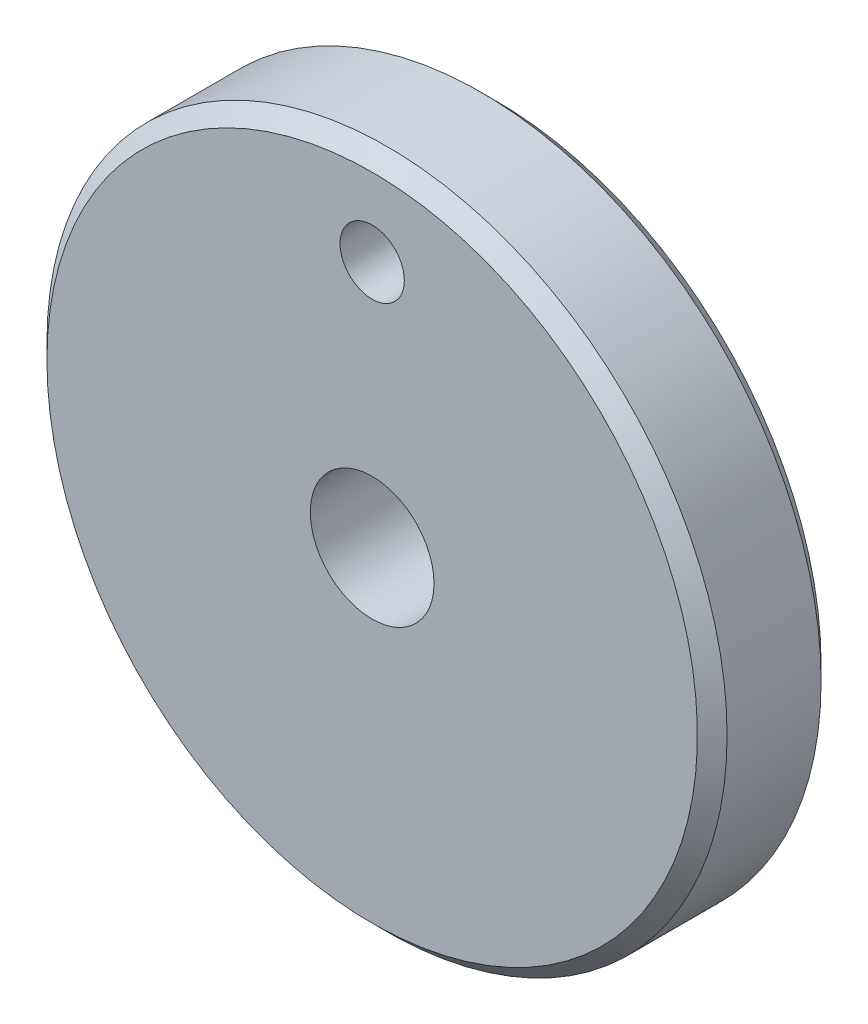
ISO-10303-21;
HEADER;
FILE_DESCRIPTION(('STEP AP214'),'2;1');
FILE_NAME('part.step','',(''),(''),'','','');
FILE_SCHEMA(('AUTOMOTIVE_DESIGN { 1 0 10303 214 1 1 1 1 }'));
ENDSEC;
DATA;
#1=APPLICATION_CONTEXT('core data for automotive mechanical design processes');
#2=APPLICATION_PROTOCOL_DEFINITION('international standard','automotive_design',2000,#1);
#3=PRODUCT_CONTEXT('',#1,'mechanical');
#4=PRODUCT('Part','Part','',(#3));
#5=PRODUCT_RELATED_PRODUCT_CATEGORY('part','',(#4));
#6=PRODUCT_DEFINITION_FORMATION('','',#4);
#7=PRODUCT_DEFINITION_CONTEXT('part definition',#1,'design');
#8=PRODUCT_DEFINITION('design','',#6,#7);
#9=PRODUCT_DEFINITION_SHAPE('','',#8);
#10=(LENGTH_UNIT() NAMED_UNIT(*) SI_UNIT(.MILLI.,.METRE.));
#11=(NAMED_UNIT(*) PLANE_ANGLE_UNIT() SI_UNIT($,.RADIAN.));
#12=(NAMED_UNIT(*) SI_UNIT($,.STERADIAN.) SOLID_ANGLE_UNIT());
#13=UNCERTAINTY_MEASURE_WITH_UNIT(LENGTH_MEASURE(1.E-05),#10,'distance_accuracy_value','');
#14=(GEOMETRIC_REPRESENTATION_CONTEXT(3) GLOBAL_UNCERTAINTY_ASSIGNED_CONTEXT((#13)) GLOBAL_UNIT_ASSIGNED_CONTEXT((#10,
#11,#12)) REPRESENTATION_CONTEXT('',''));
#15=CARTESIAN_POINT('',(0.,0.,0.));
#16=DIRECTION('',(0.,0.,1.));
#17=DIRECTION('',(1.,0.,0.));
#18=AXIS2_PLACEMENT_3D('',#15,#16,#17);
#19=CARTESIAN_POINT('',(0.,0.,6.35));
#20=DIRECTION('',(0.,0.,1.));
#21=DIRECTION('',(1.,0.,0.));
#22=AXIS2_PLACEMENT_3D('',#19,#20,#21);
#23=PLANE('',#22);
#24=CARTESIAN_POINT('',(0.,0.,6.35));
#25=DIRECTION('',(0.,0.,1.));
#26=DIRECTION('',(1.,0.,0.));
#27=AXIS2_PLACEMENT_3D('',#24,#25,#26);
#28=CIRCLE('',#27,16.7005);
#29=CARTESIAN_POINT('',(-16.7005,0.,6.35));
#30=VERTEX_POINT('',#29);
#31=EDGE_CURVE('E46',#30,#30,#28,.T.);
#32=ORIENTED_EDGE('',*,*,#31,.T.);
#33=EDGE_LOOP('',(#32));
#34=FACE_BOUND('',#33,.T.);
#35=CARTESIAN_POINT('',(0.,12.7,6.35));
#36=DIRECTION('',(0.,0.,1.));
#37=DIRECTION('',(1.,0.,0.));
#38=AXIS2_PLACEMENT_3D('',#35,#36,#37);
#39=CIRCLE('',#38,1.651);
#40=CARTESIAN_POINT('',(1.651,12.7,6.35));
#41=VERTEX_POINT('',#40);
#42=EDGE_CURVE('E56',#41,#41,#39,.T.);
#43=ORIENTED_EDGE('',*,*,#42,.F.);
#44=EDGE_LOOP('',(#43));
#45=FACE_BOUND('',#44,.T.);
#46=CARTESIAN_POINT('',(0.,0.,6.35));
#47=DIRECTION('',(0.,0.,1.));
#48=DIRECTION('',(1.,0.,0.));
#49=AXIS2_PLACEMENT_3D('',#46,#47,#48);
#50=CIRCLE('',#49,3.175);
#51=CARTESIAN_POINT('',(3.175,0.,6.35));
#52=VERTEX_POINT('',#51);
#53=EDGE_CURVE('E51',#52,#52,#50,.T.);
#54=ORIENTED_EDGE('',*,*,#53,.F.);
#55=EDGE_LOOP('',(#54));
#56=FACE_BOUND('',#55,.T.);
#57=ADVANCED_FACE('F31',(#34,#45,#56),#23,.T.);
#58=CARTESIAN_POINT('',(0.,0.,0.));
#59=DIRECTION('',(0.,0.,1.));
#60=DIRECTION('',(1.,0.,0.));
#61=AXIS2_PLACEMENT_3D('',#58,#59,#60);
#62=PLANE('',#61);
#63=CARTESIAN_POINT('',(0.,0.,0.));
#64=DIRECTION('',(0.,0.,1.));
#65=DIRECTION('',(1.,0.,0.));
#66=AXIS2_PLACEMENT_3D('',#63,#64,#65);
#67=CIRCLE('',#66,16.7005);
#68=CARTESIAN_POINT('',(16.7005,0.,0.));
#69=VERTEX_POINT('',#68);
#70=EDGE_CURVE('E10',#69,#69,#67,.F.);
#71=ORIENTED_EDGE('',*,*,#70,.T.);
#72=EDGE_LOOP('',(#71));
#73=FACE_BOUND('',#72,.T.);
#74=CARTESIAN_POINT('',(0.,12.7,0.));
#75=DIRECTION('',(0.,0.,1.));
#76=DIRECTION('',(1.,0.,0.));
#77=AXIS2_PLACEMENT_3D('',#74,#75,#76);
#78=CIRCLE('',#77,1.651);
#79=CARTESIAN_POINT('',(1.651,12.7,0.));
#80=VERTEX_POINT('',#79);
#81=EDGE_CURVE('E52',#80,#80,#78,.T.);
#82=ORIENTED_EDGE('',*,*,#81,.T.);
#83=EDGE_LOOP('',(#82));
#84=FACE_BOUND('',#83,.T.);
#85=CARTESIAN_POINT('',(0.,0.,0.));
#86=DIRECTION('',(0.,0.,1.));
#87=DIRECTION('',(1.,0.,0.));
#88=AXIS2_PLACEMENT_3D('',#85,#86,#87);
#89=CIRCLE('',#88,3.175);
#90=CARTESIAN_POINT('',(3.175,0.,0.));
#91=VERTEX_POINT('',#90);
#92=EDGE_CURVE('E55',#91,#91,#89,.T.);
#93=ORIENTED_EDGE('',*,*,#92,.T.);
#94=EDGE_LOOP('',(#93));
#95=FACE_BOUND('',#94,.T.);
#96=ADVANCED_FACE('F69',(#73,#84,#95),#62,.F.);
#97=CARTESIAN_POINT('',(0.,0.,6.35));
#98=DIRECTION('',(0.,0.,-1.));
#99=DIRECTION('',(-1.,0.,0.));
#100=AXIS2_PLACEMENT_3D('',#97,#98,#99);
#101=CYLINDRICAL_SURFACE('',#100,17.4625);
#102=CARTESIAN_POINT('',(0.,0.,0.761999999999999));
#103=DIRECTION('',(0.,0.,1.));
#104=DIRECTION('',(1.,0.,0.));
#105=AXIS2_PLACEMENT_3D('',#102,#103,#104);
#106=CIRCLE('',#105,17.4625);
#107=CARTESIAN_POINT('',(17.4625,0.,0.761999999999999));
#108=VERTEX_POINT('',#107);
#109=EDGE_CURVE('E38',#108,#108,#106,.T.);
#110=ORIENTED_EDGE('',*,*,#109,.T.);
#111=EDGE_LOOP('',(#110));
#112=FACE_BOUND('',#111,.T.);
#113=CARTESIAN_POINT('',(0.,0.,5.58800000000001));
#114=DIRECTION('',(0.,0.,1.));
#115=DIRECTION('',(1.,0.,0.));
#116=AXIS2_PLACEMENT_3D('',#113,#114,#115);
#117=CIRCLE('',#116,17.4625);
#118=CARTESIAN_POINT('',(-17.4625,0.,5.58800000000001));
#119=VERTEX_POINT('',#118);
#120=EDGE_CURVE('E42',#119,#119,#117,.F.);
#121=ORIENTED_EDGE('',*,*,#120,.T.);
#122=EDGE_LOOP('',(#121));
#123=FACE_BOUND('',#122,.T.);
#124=ADVANCED_FACE('F77',(#112,#123),#101,.T.);
#125=CARTESIAN_POINT('',(0.,0.,6.35));
#126=DIRECTION('',(0.,0.,-1.));
#127=DIRECTION('',(-1.,0.,0.));
#128=AXIS2_PLACEMENT_3D('',#125,#126,#127);
#129=CYLINDRICAL_SURFACE('',#128,3.175);
#130=ORIENTED_EDGE('',*,*,#53,.T.);
#131=EDGE_LOOP('',(#130));
#132=FACE_BOUND('',#131,.T.);
#133=ORIENTED_EDGE('',*,*,#92,.F.);
#134=EDGE_LOOP('',(#133));
#135=FACE_BOUND('',#134,.T.);
#136=ADVANCED_FACE('F74',(#132,#135),#129,.F.);
#137=CARTESIAN_POINT('',(0.,12.7,-10.16));
#138=DIRECTION('',(0.,0.,1.));
#139=DIRECTION('',(1.,0.,0.));
#140=AXIS2_PLACEMENT_3D('',#137,#138,#139);
#141=CYLINDRICAL_SURFACE('',#140,1.651);
#142=ORIENTED_EDGE('',*,*,#42,.T.);
#143=EDGE_LOOP('',(#142));
#144=FACE_BOUND('',#143,.T.);
#145=ORIENTED_EDGE('',*,*,#81,.F.);
#146=EDGE_LOOP('',(#145));
#147=FACE_BOUND('',#146,.T.);
#148=ADVANCED_FACE('F64',(#144,#147),#141,.F.);
#149=CARTESIAN_POINT('',(0.,0.,6.35));
#150=DIRECTION('',(0.,0.,-1.));
#151=DIRECTION('',(-1.,0.,0.));
#152=AXIS2_PLACEMENT_3D('',#149,#150,#151);
#153=CONICAL_SURFACE('',#152,16.7005,0.785398163397446);
#154=CARTESIAN_POINT('',(-17.4625,0.,5.58800000000001));
#155=CARTESIAN_POINT('',(-17.4545625,0.,5.59593750000001));
#156=CARTESIAN_POINT('',(-17.446625,0.,5.60387500000001));
#157=CARTESIAN_POINT('',(-17.43075,0.,5.61975000000001));
#158=CARTESIAN_POINT('',(-17.4228125,0.,5.62768750000001));
#159=CARTESIAN_POINT('',(-17.4069375,0.,5.64356250000001));
#160=CARTESIAN_POINT('',(-17.399,0.,5.65150000000001));
#161=CARTESIAN_POINT('',(-17.383125,0.,5.66737500000001));
#162=CARTESIAN_POINT('',(-17.3751875,0.,5.67531250000001));
#163=CARTESIAN_POINT('',(-17.3593125,0.,5.69118750000001));
#164=CARTESIAN_POINT('',(-17.351375,0.,5.69912500000001));
#165=CARTESIAN_POINT('',(-17.3355,0.,5.71500000000001));
#166=CARTESIAN_POINT('',(-17.3275625,0.,5.72293750000001));
#167=CARTESIAN_POINT('',(-17.3116875,0.,5.73881250000001));
#168=CARTESIAN_POINT('',(-17.30375,0.,5.74675000000001));
#169=CARTESIAN_POINT('',(-17.287875,0.,5.76262500000001));
#170=CARTESIAN_POINT('',(-17.2799375,0.,5.77056250000001));
#171=CARTESIAN_POINT('',(-17.2640625,0.,5.78643750000001));
#172=CARTESIAN_POINT('',(-17.256125,0.,5.79437500000001));
#173=CARTESIAN_POINT('',(-17.24025,0.,5.81025000000001));
#174=CARTESIAN_POINT('',(-17.2323125,0.,5.81818750000001));
#175=CARTESIAN_POINT('',(-17.2164375,0.,5.83406250000001));
#176=CARTESIAN_POINT('',(-17.2085,0.,5.84200000000001));
#177=CARTESIAN_POINT('',(-17.192625,0.,5.85787500000001));
#178=CARTESIAN_POINT('',(-17.1846875,0.,5.86581250000001));
#179=CARTESIAN_POINT('',(-17.1688125,0.,5.88168750000001));
#180=CARTESIAN_POINT('',(-17.160875,0.,5.88962500000001));
#181=CARTESIAN_POINT('',(-17.145,0.,5.90550000000001));
#182=CARTESIAN_POINT('',(-17.1370625,0.,5.91343750000001));
#183=CARTESIAN_POINT('',(-17.1211875,0.,5.92931250000001));
#184=CARTESIAN_POINT('',(-17.11325,0.,5.93725000000001));
#185=CARTESIAN_POINT('',(-17.097375,0.,5.95312500000001));
#186=CARTESIAN_POINT('',(-17.0894375,0.,5.9610625));
#187=CARTESIAN_POINT('',(-17.0735625,0.,5.9769375));
#188=CARTESIAN_POINT('',(-17.065625,0.,5.98487500000001));
#189=CARTESIAN_POINT('',(-17.04975,0.,6.00075000000001));
#190=CARTESIAN_POINT('',(-17.0418125,0.,6.0086875));
#191=CARTESIAN_POINT('',(-17.0259375,0.,6.0245625));
#192=CARTESIAN_POINT('',(-17.018,0.,6.03250000000001));
#193=CARTESIAN_POINT('',(-17.002125,0.,6.048375));
#194=CARTESIAN_POINT('',(-16.9941875,0.,6.0563125));
#195=CARTESIAN_POINT('',(-16.9783125,0.,6.0721875));
#196=CARTESIAN_POINT('',(-16.970375,0.,6.080125));
#197=CARTESIAN_POINT('',(-16.9545,0.,6.096));
#198=CARTESIAN_POINT('',(-16.9465625,0.,6.1039375));
#199=CARTESIAN_POINT('',(-16.9306875,0.,6.1198125));
#200=CARTESIAN_POINT('',(-16.92275,0.,6.12775));
#201=CARTESIAN_POINT('',(-16.906875,0.,6.143625));
#202=CARTESIAN_POINT('',(-16.8989375,0.,6.1515625));
#203=CARTESIAN_POINT('',(-16.8830625,0.,6.1674375));
#204=CARTESIAN_POINT('',(-16.875125,0.,6.175375));
#205=CARTESIAN_POINT('',(-16.85925,0.,6.19125));
#206=CARTESIAN_POINT('',(-16.8513125,0.,6.1991875));
#207=CARTESIAN_POINT('',(-16.8354375,0.,6.2150625));
#208=CARTESIAN_POINT('',(-16.8275,0.,6.223));
#209=CARTESIAN_POINT('',(-16.811625,0.,6.238875));
#210=CARTESIAN_POINT('',(-16.8036875,0.,6.2468125));
#211=CARTESIAN_POINT('',(-16.7878125,0.,6.2626875));
#212=CARTESIAN_POINT('',(-16.779875,0.,6.270625));
#213=CARTESIAN_POINT('',(-16.764,0.,6.2865));
#214=CARTESIAN_POINT('',(-16.7560625,0.,6.2944375));
#215=CARTESIAN_POINT('',(-16.7401875,0.,6.3103125));
#216=CARTESIAN_POINT('',(-16.73225,0.,6.31825));
#217=CARTESIAN_POINT('',(-16.716375,0.,6.334125));
#218=CARTESIAN_POINT('',(-16.7084375,0.,6.3420625));
#219=CARTESIAN_POINT('',(-16.7005,0.,6.35));
#220=B_SPLINE_CURVE_WITH_KNOTS('',3,(#154,#155,#156,#157,#158,#159,#160,#161,#162,#163,#164,
#165,#166,#167,#168,#169,#170,#171,#172,#173,#174,#175,#176,#177,#178,#179,#180,#181,#182,#183,
#184,#185,#186,#187,#188,#189,#190,#191,#192,#193,#194,#195,#196,#197,#198,#199,#200,#201,#202,
#203,#204,#205,#206,#207,#208,#209,#210,#211,#212,#213,#214,#215,#216,#217,#218,#219),
.UNSPECIFIED.,.F.,.F.,(4,2,2,2,2,2,2,2,2,2,2,2,2,2,2,2,2,2,2,2,2,2,2,2,2,2,2,2,2,2,2,2,4),(0.,
0.033675960454008,0.0673519209080179,0.101027881362025,0.134703841816035,0.168379802270043,
0.202055762724053,0.23573172317806,0.26940768363207,0.303083644086078,0.336759604540088,
0.370435564994095,0.404111525448105,0.437787485902113,0.471463446356122,0.50513940681013,
0.53881536726414,0.572491327718148,0.606167288172158,0.639843248626165,0.673519209080175,
0.707195169534182,0.740871129988192,0.7745470904422,0.80822305089621,0.841899011350217,
0.875574971804227,0.909250932258235,0.942926892712245,0.976602853166252,1.01027881362026,
1.04395477407427,1.07763073452828),.UNSPECIFIED.);
#221=EDGE_CURVE('BSEAM88',#119,#30,#220,.T.);
#222=ORIENTED_EDGE('',*,*,#120,.F.);
#223=ORIENTED_EDGE('',*,*,#31,.F.);
#224=ORIENTED_EDGE('',*,*,#221,.T.);
#225=ORIENTED_EDGE('',*,*,#221,.F.);
#226=EDGE_LOOP('',(#222,#224,#223,#225));
#227=FACE_BOUND('',#226,.T.);
#228=ADVANCED_FACE('F88',(#227),#153,.T.);
#229=CARTESIAN_POINT('',(0.,0.,0.761999999999999));
#230=DIRECTION('',(0.,0.,1.));
#231=DIRECTION('',(1.,0.,0.));
#232=AXIS2_PLACEMENT_3D('',#229,#230,#231);
#233=CONICAL_SURFACE('',#232,17.4625,0.785398163397451);
#234=ORIENTED_EDGE('',*,*,#70,.F.);
#235=EDGE_LOOP('',(#234));
#236=FACE_BOUND('',#235,.T.);
#237=ORIENTED_EDGE('',*,*,#109,.F.);
#238=EDGE_LOOP('',(#237));
#239=FACE_BOUND('',#238,.T.);
#240=ADVANCED_FACE('F33',(#236,#239),#233,.T.);
#241=CLOSED_SHELL('',(#57,#96,#124,#136,#148,#228,#240));
#242=MANIFOLD_SOLID_BREP('B2',#241);
#243=ADVANCED_BREP_SHAPE_REPRESENTATION('',(#18,#242),#14);
#244=SHAPE_DEFINITION_REPRESENTATION(#9,#243);
ENDSEC;
END-ISO-10303-21;
